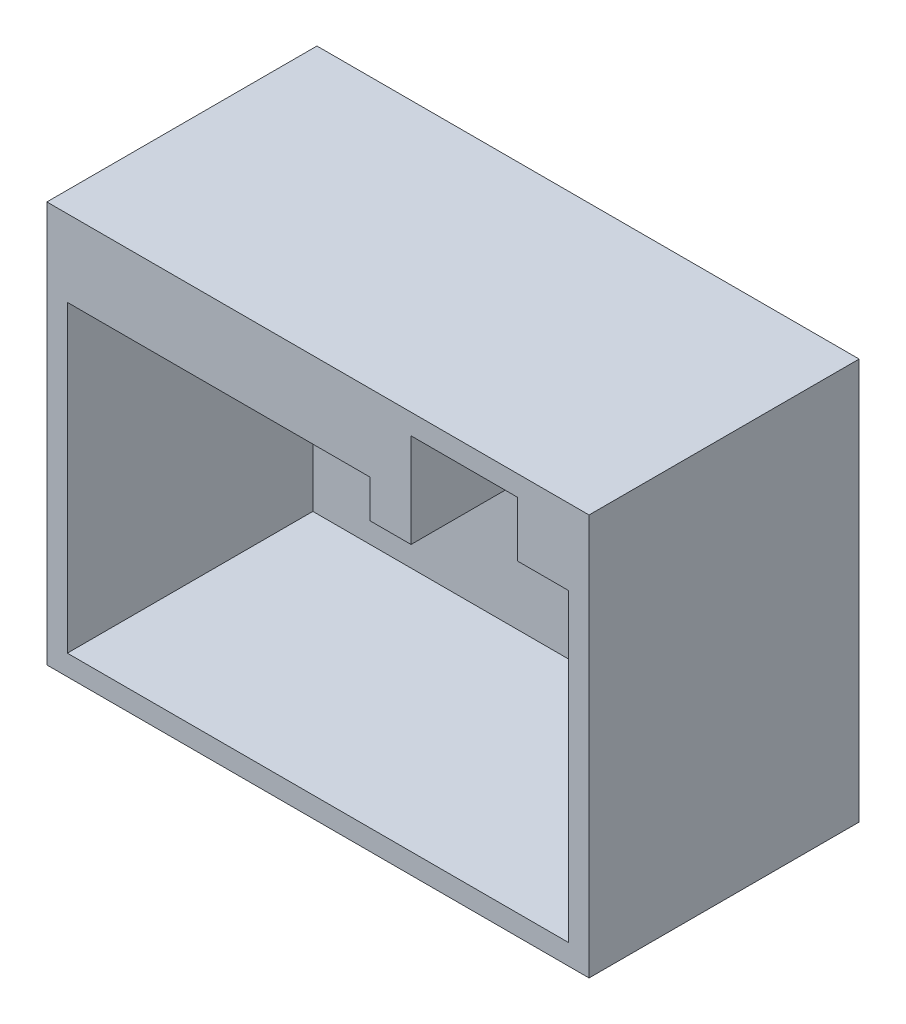
ISO-10303-21;
HEADER;
FILE_DESCRIPTION(('STEP AP214'),'2;1');
FILE_NAME('part.step','',(''),(''),'','','');
FILE_SCHEMA(('AUTOMOTIVE_DESIGN { 1 0 10303 214 1 1 1 1 }'));
ENDSEC;
DATA;
#1=APPLICATION_CONTEXT('core data for automotive mechanical design processes');
#2=APPLICATION_PROTOCOL_DEFINITION('international standard','automotive_design',2000,#1);
#3=PRODUCT_CONTEXT('',#1,'mechanical');
#4=PRODUCT('Part','Part','',(#3));
#5=PRODUCT_RELATED_PRODUCT_CATEGORY('part','',(#4));
#6=PRODUCT_DEFINITION_FORMATION('','',#4);
#7=PRODUCT_DEFINITION_CONTEXT('part definition',#1,'design');
#8=PRODUCT_DEFINITION('design','',#6,#7);
#9=PRODUCT_DEFINITION_SHAPE('','',#8);
#10=(LENGTH_UNIT() NAMED_UNIT(*) SI_UNIT(.MILLI.,.METRE.));
#11=(NAMED_UNIT(*) PLANE_ANGLE_UNIT() SI_UNIT($,.RADIAN.));
#12=(NAMED_UNIT(*) SI_UNIT($,.STERADIAN.) SOLID_ANGLE_UNIT());
#13=UNCERTAINTY_MEASURE_WITH_UNIT(LENGTH_MEASURE(1.E-05),#10,'distance_accuracy_value','');
#14=(GEOMETRIC_REPRESENTATION_CONTEXT(3) GLOBAL_UNCERTAINTY_ASSIGNED_CONTEXT((#13)) GLOBAL_UNIT_ASSIGNED_CONTEXT((#10,
#11,#12)) REPRESENTATION_CONTEXT('',''));
#15=CARTESIAN_POINT('',(0.,0.,0.));
#16=DIRECTION('',(0.,0.,1.));
#17=DIRECTION('',(1.,0.,0.));
#18=AXIS2_PLACEMENT_3D('',#15,#16,#17);
#19=CARTESIAN_POINT('',(0.,4470.4,-304.8));
#20=DIRECTION('',(0.,-1.,0.));
#21=DIRECTION('',(0.,0.,-1.));
#22=AXIS2_PLACEMENT_3D('',#19,#20,#21);
#23=PLANE('',#22);
#24=DIRECTION('',(1.,0.,0.));
#25=VECTOR('',#24,1.);
#26=CARTESIAN_POINT('',(0.,4470.4,0.));
#27=LINE('',#26,#25);
#28=CARTESIAN_POINT('',(4267.2,4470.4,0.));
#29=VERTEX_POINT('',#28);
#30=CARTESIAN_POINT('',(5588.,4470.4,0.));
#31=VERTEX_POINT('',#30);
#32=EDGE_CURVE('E218',#29,#31,#27,.T.);
#33=ORIENTED_EDGE('',*,*,#32,.T.);
#34=DIRECTION('',(0.,0.,-1.));
#35=VECTOR('',#34,1.);
#36=CARTESIAN_POINT('',(5588.,4470.4,7472.26879834397));
#37=LINE('',#36,#35);
#38=CARTESIAN_POINT('',(5588.,4470.4,3048.));
#39=VERTEX_POINT('',#38);
#40=EDGE_CURVE('E193',#39,#31,#37,.T.);
#41=ORIENTED_EDGE('',*,*,#40,.F.);
#42=DIRECTION('',(1.,0.,0.));
#43=VECTOR('',#42,1.);
#44=CARTESIAN_POINT('',(0.,4470.4,3048.));
#45=LINE('',#44,#43);
#46=CARTESIAN_POINT('',(4267.2,4470.4,3048.));
#47=VERTEX_POINT('',#46);
#48=EDGE_CURVE('E104',#47,#39,#45,.T.);
#49=ORIENTED_EDGE('',*,*,#48,.F.);
#50=DIRECTION('',(0.,0.,-1.));
#51=VECTOR('',#50,1.);
#52=CARTESIAN_POINT('',(4267.2,4470.4,7472.26879834397));
#53=LINE('',#52,#51);
#54=EDGE_CURVE('E310',#47,#29,#53,.T.);
#55=ORIENTED_EDGE('',*,*,#54,.T.);
#56=EDGE_LOOP('',(#33,#41,#49,#55));
#57=FACE_BOUND('',#56,.T.);
#58=ADVANCED_FACE('F81',(#57),#23,.T.);
#59=CARTESIAN_POINT('',(6223.,0.,-304.8));
#60=DIRECTION('',(1.,0.,0.));
#61=DIRECTION('',(0.,0.,-1.));
#62=AXIS2_PLACEMENT_3D('',#59,#60,#61);
#63=PLANE('',#62);
#64=DIRECTION('',(0.,0.,-1.));
#65=VECTOR('',#64,1.);
#66=CARTESIAN_POINT('',(6223.,3784.6,7472.26879834397));
#67=LINE('',#66,#65);
#68=CARTESIAN_POINT('',(6223.,3784.6,3048.));
#69=VERTEX_POINT('',#68);
#70=CARTESIAN_POINT('',(6223.,3784.6,0.));
#71=VERTEX_POINT('',#70);
#72=EDGE_CURVE('E188',#69,#71,#67,.T.);
#73=ORIENTED_EDGE('',*,*,#72,.T.);
#74=DIRECTION('',(0.,1.,0.));
#75=VECTOR('',#74,1.);
#76=CARTESIAN_POINT('',(6223.,0.,0.));
#77=LINE('',#76,#75);
#78=CARTESIAN_POINT('',(6223.,0.,0.));
#79=VERTEX_POINT('',#78);
#80=EDGE_CURVE('E198',#79,#71,#77,.T.);
#81=ORIENTED_EDGE('',*,*,#80,.F.);
#82=DIRECTION('',(0.,0.,1.));
#83=VECTOR('',#82,1.);
#84=CARTESIAN_POINT('',(6223.,0.,-304.8));
#85=LINE('',#84,#83);
#86=CARTESIAN_POINT('',(6223.,0.,3048.));
#87=VERTEX_POINT('',#86);
#88=EDGE_CURVE('E241',#79,#87,#85,.T.);
#89=ORIENTED_EDGE('',*,*,#88,.T.);
#90=DIRECTION('',(0.,1.,0.));
#91=VECTOR('',#90,1.);
#92=CARTESIAN_POINT('',(6223.,0.,3048.));
#93=LINE('',#92,#91);
#94=EDGE_CURVE('E201',#87,#69,#93,.T.);
#95=ORIENTED_EDGE('',*,*,#94,.T.);
#96=EDGE_LOOP('',(#73,#81,#89,#95));
#97=FACE_BOUND('',#96,.T.);
#98=ADVANCED_FACE('F197',(#97),#63,.F.);
#99=CARTESIAN_POINT('',(0.,0.,0.));
#100=DIRECTION('',(0.,0.,1.));
#101=DIRECTION('',(1.,0.,0.));
#102=AXIS2_PLACEMENT_3D('',#99,#100,#101);
#103=PLANE('',#102);
#104=DIRECTION('',(1.,0.,0.));
#105=VECTOR('',#104,1.);
#106=CARTESIAN_POINT('',(0.,3784.6,0.));
#107=LINE('',#106,#105);
#108=CARTESIAN_POINT('',(5588.,3784.6,0.));
#109=VERTEX_POINT('',#108);
#110=EDGE_CURVE('E184',#109,#71,#107,.T.);
#111=ORIENTED_EDGE('',*,*,#110,.F.);
#112=DIRECTION('',(0.,-1.,0.));
#113=VECTOR('',#112,1.);
#114=CARTESIAN_POINT('',(5588.,0.,0.));
#115=LINE('',#114,#113);
#116=EDGE_CURVE('E96',#31,#109,#115,.T.);
#117=ORIENTED_EDGE('',*,*,#116,.F.);
#118=ORIENTED_EDGE('',*,*,#32,.F.);
#119=DIRECTION('',(0.,-1.,0.));
#120=VECTOR('',#119,1.);
#121=CARTESIAN_POINT('',(4267.2,0.,0.));
#122=LINE('',#121,#120);
#123=CARTESIAN_POINT('',(4267.2,3302.,0.));
#124=VERTEX_POINT('',#123);
#125=EDGE_CURVE('E311',#29,#124,#122,.T.);
#126=ORIENTED_EDGE('',*,*,#125,.T.);
#127=DIRECTION('',(-1.,0.,0.));
#128=VECTOR('',#127,1.);
#129=CARTESIAN_POINT('',(0.,3302.,0.));
#130=LINE('',#129,#128);
#131=CARTESIAN_POINT('',(3759.2,3302.,0.));
#132=VERTEX_POINT('',#131);
#133=EDGE_CURVE('E329',#124,#132,#130,.T.);
#134=ORIENTED_EDGE('',*,*,#133,.T.);
#135=DIRECTION('',(0.,1.,0.));
#136=VECTOR('',#135,1.);
#137=CARTESIAN_POINT('',(3759.2,0.,0.));
#138=LINE('',#137,#136);
#139=CARTESIAN_POINT('',(3759.2,3771.9,0.));
#140=VERTEX_POINT('',#139);
#141=EDGE_CURVE('E326',#132,#140,#138,.T.);
#142=ORIENTED_EDGE('',*,*,#141,.T.);
#143=DIRECTION('',(-1.,0.,0.));
#144=VECTOR('',#143,1.);
#145=CARTESIAN_POINT('',(-4.45589511234691E-13,3771.9,0.));
#146=LINE('',#145,#144);
#147=CARTESIAN_POINT('',(0.,3771.9,0.));
#148=VERTEX_POINT('',#147);
#149=EDGE_CURVE('E324',#140,#148,#146,.T.);
#150=ORIENTED_EDGE('',*,*,#149,.T.);
#151=DIRECTION('',(0.,1.,0.));
#152=VECTOR('',#151,1.);
#153=CARTESIAN_POINT('',(0.,0.,0.));
#154=LINE('',#153,#152);
#155=CARTESIAN_POINT('',(0.,0.,-1.11022302462516E-13));
#156=VERTEX_POINT('',#155);
#157=EDGE_CURVE('E210',#156,#148,#154,.T.);
#158=ORIENTED_EDGE('',*,*,#157,.F.);
#159=DIRECTION('',(1.,0.,0.));
#160=VECTOR('',#159,1.);
#161=CARTESIAN_POINT('',(0.,0.,0.));
#162=LINE('',#161,#160);
#163=EDGE_CURVE('E205',#156,#79,#162,.T.);
#164=ORIENTED_EDGE('',*,*,#163,.T.);
#165=ORIENTED_EDGE('',*,*,#80,.T.);
#166=EDGE_LOOP('',(#111,#117,#118,#126,#134,#142,#150,#158,#164,#165));
#167=FACE_BOUND('',#166,.T.);
#168=ADVANCED_FACE('F203',(#167),#103,.T.);
#169=CARTESIAN_POINT('',(0.,0.,-304.8));
#170=DIRECTION('',(0.,0.,-1.));
#171=DIRECTION('',(-1.,0.,0.));
#172=AXIS2_PLACEMENT_3D('',#169,#170,#171);
#173=PLANE('',#172);
#174=DIRECTION('',(0.,1.,0.));
#175=VECTOR('',#174,1.);
#176=CARTESIAN_POINT('',(-254.,0.,-304.8));
#177=LINE('',#176,#175);
#178=CARTESIAN_POINT('',(-254.,-254.,-304.8));
#179=VERTEX_POINT('',#178);
#180=CARTESIAN_POINT('',(-254.,4724.4,-304.8));
#181=VERTEX_POINT('',#180);
#182=EDGE_CURVE('E243',#179,#181,#177,.T.);
#183=ORIENTED_EDGE('',*,*,#182,.T.);
#184=DIRECTION('',(1.,0.,0.));
#185=VECTOR('',#184,1.);
#186=CARTESIAN_POINT('',(0.,4724.4,-304.8));
#187=LINE('',#186,#185);
#188=CARTESIAN_POINT('',(6477.,4724.4,-304.8));
#189=VERTEX_POINT('',#188);
#190=EDGE_CURVE('E246',#181,#189,#187,.T.);
#191=ORIENTED_EDGE('',*,*,#190,.T.);
#192=DIRECTION('',(0.,1.,0.));
#193=VECTOR('',#192,1.);
#194=CARTESIAN_POINT('',(6477.,0.,-304.8));
#195=LINE('',#194,#193);
#196=CARTESIAN_POINT('',(6477.,-254.,-304.8));
#197=VERTEX_POINT('',#196);
#198=EDGE_CURVE('E248',#197,#189,#195,.T.);
#199=ORIENTED_EDGE('',*,*,#198,.F.);
#200=DIRECTION('',(1.,0.,0.));
#201=VECTOR('',#200,1.);
#202=CARTESIAN_POINT('',(0.,-254.,-304.8));
#203=LINE('',#202,#201);
#204=EDGE_CURVE('E251',#179,#197,#203,.T.);
#205=ORIENTED_EDGE('',*,*,#204,.F.);
#206=EDGE_LOOP('',(#183,#191,#199,#205));
#207=FACE_BOUND('',#206,.T.);
#208=ADVANCED_FACE('F276',(#207),#173,.T.);
#209=CARTESIAN_POINT('',(-254.,0.,-304.8));
#210=DIRECTION('',(1.,0.,0.));
#211=DIRECTION('',(0.,0.,-1.));
#212=AXIS2_PLACEMENT_3D('',#209,#210,#211);
#213=PLANE('',#212);
#214=DIRECTION('',(0.,0.,1.));
#215=VECTOR('',#214,1.);
#216=CARTESIAN_POINT('',(-254.,-254.,-304.8));
#217=LINE('',#216,#215);
#218=CARTESIAN_POINT('',(-254.,-254.,3048.));
#219=VERTEX_POINT('',#218);
#220=EDGE_CURVE('E254',#179,#219,#217,.T.);
#221=ORIENTED_EDGE('',*,*,#220,.T.);
#222=DIRECTION('',(0.,1.,0.));
#223=VECTOR('',#222,1.);
#224=CARTESIAN_POINT('',(-254.,0.,3048.));
#225=LINE('',#224,#223);
#226=CARTESIAN_POINT('',(-254.,4724.4,3048.));
#227=VERTEX_POINT('',#226);
#228=EDGE_CURVE('E227',#219,#227,#225,.T.);
#229=ORIENTED_EDGE('',*,*,#228,.T.);
#230=DIRECTION('',(0.,0.,1.));
#231=VECTOR('',#230,1.);
#232=CARTESIAN_POINT('',(-254.,4724.4,-304.8));
#233=LINE('',#232,#231);
#234=EDGE_CURVE('E12',#181,#227,#233,.T.);
#235=ORIENTED_EDGE('',*,*,#234,.F.);
#236=ORIENTED_EDGE('',*,*,#182,.F.);
#237=EDGE_LOOP('',(#221,#229,#235,#236));
#238=FACE_BOUND('',#237,.T.);
#239=ADVANCED_FACE('F83',(#238),#213,.F.);
#240=CARTESIAN_POINT('',(0.,4724.4,-304.8));
#241=DIRECTION('',(0.,-1.,0.));
#242=DIRECTION('',(0.,0.,-1.));
#243=AXIS2_PLACEMENT_3D('',#240,#241,#242);
#244=PLANE('',#243);
#245=ORIENTED_EDGE('',*,*,#234,.T.);
#246=DIRECTION('',(1.,0.,0.));
#247=VECTOR('',#246,1.);
#248=CARTESIAN_POINT('',(0.,4724.4,3048.));
#249=LINE('',#248,#247);
#250=CARTESIAN_POINT('',(6477.,4724.4,3048.));
#251=VERTEX_POINT('',#250);
#252=EDGE_CURVE('E230',#227,#251,#249,.T.);
#253=ORIENTED_EDGE('',*,*,#252,.T.);
#254=DIRECTION('',(0.,0.,1.));
#255=VECTOR('',#254,1.);
#256=CARTESIAN_POINT('',(6477.,4724.4,-304.8));
#257=LINE('',#256,#255);
#258=EDGE_CURVE('E89',#189,#251,#257,.T.);
#259=ORIENTED_EDGE('',*,*,#258,.F.);
#260=ORIENTED_EDGE('',*,*,#190,.F.);
#261=EDGE_LOOP('',(#245,#253,#259,#260));
#262=FACE_BOUND('',#261,.T.);
#263=ADVANCED_FACE('F268',(#262),#244,.F.);
#264=CARTESIAN_POINT('',(6477.,0.,-304.8));
#265=DIRECTION('',(1.,0.,0.));
#266=DIRECTION('',(0.,0.,-1.));
#267=AXIS2_PLACEMENT_3D('',#264,#265,#266);
#268=PLANE('',#267);
#269=ORIENTED_EDGE('',*,*,#258,.T.);
#270=DIRECTION('',(0.,1.,0.));
#271=VECTOR('',#270,1.);
#272=CARTESIAN_POINT('',(6477.,0.,3048.));
#273=LINE('',#272,#271);
#274=CARTESIAN_POINT('',(6477.,-254.,3048.));
#275=VERTEX_POINT('',#274);
#276=EDGE_CURVE('E233',#275,#251,#273,.T.);
#277=ORIENTED_EDGE('',*,*,#276,.F.);
#278=DIRECTION('',(0.,0.,1.));
#279=VECTOR('',#278,1.);
#280=CARTESIAN_POINT('',(6477.,-254.,-304.8));
#281=LINE('',#280,#279);
#282=EDGE_CURVE('E256',#197,#275,#281,.T.);
#283=ORIENTED_EDGE('',*,*,#282,.F.);
#284=ORIENTED_EDGE('',*,*,#198,.T.);
#285=EDGE_LOOP('',(#269,#277,#283,#284));
#286=FACE_BOUND('',#285,.T.);
#287=ADVANCED_FACE('F260',(#286),#268,.T.);
#288=CARTESIAN_POINT('',(0.,-254.,-304.8));
#289=DIRECTION('',(0.,-1.,0.));
#290=DIRECTION('',(0.,0.,-1.));
#291=AXIS2_PLACEMENT_3D('',#288,#289,#290);
#292=PLANE('',#291);
#293=ORIENTED_EDGE('',*,*,#282,.T.);
#294=DIRECTION('',(1.,0.,0.));
#295=VECTOR('',#294,1.);
#296=CARTESIAN_POINT('',(0.,-254.,3048.));
#297=LINE('',#296,#295);
#298=EDGE_CURVE('E236',#219,#275,#297,.T.);
#299=ORIENTED_EDGE('',*,*,#298,.F.);
#300=ORIENTED_EDGE('',*,*,#220,.F.);
#301=ORIENTED_EDGE('',*,*,#204,.T.);
#302=EDGE_LOOP('',(#293,#299,#300,#301));
#303=FACE_BOUND('',#302,.T.);
#304=ADVANCED_FACE('F274',(#303),#292,.T.);
#305=CARTESIAN_POINT('',(0.,0.,-304.8));
#306=DIRECTION('',(1.,0.,0.));
#307=DIRECTION('',(0.,0.,-1.));
#308=AXIS2_PLACEMENT_3D('',#305,#306,#307);
#309=PLANE('',#308);
#310=DIRECTION('',(0.,0.,-1.));
#311=VECTOR('',#310,1.);
#312=CARTESIAN_POINT('',(0.,3771.9,7472.26879834397));
#313=LINE('',#312,#311);
#314=CARTESIAN_POINT('',(0.,3771.9,3048.));
#315=VERTEX_POINT('',#314);
#316=EDGE_CURVE('E304',#315,#148,#313,.T.);
#317=ORIENTED_EDGE('',*,*,#316,.F.);
#318=DIRECTION('',(0.,1.,0.));
#319=VECTOR('',#318,1.);
#320=CARTESIAN_POINT('',(0.,0.,3048.));
#321=LINE('',#320,#319);
#322=CARTESIAN_POINT('',(0.,0.,3048.));
#323=VERTEX_POINT('',#322);
#324=EDGE_CURVE('E206',#323,#315,#321,.T.);
#325=ORIENTED_EDGE('',*,*,#324,.F.);
#326=DIRECTION('',(0.,0.,1.));
#327=VECTOR('',#326,1.);
#328=CARTESIAN_POINT('',(0.,0.,-304.8));
#329=LINE('',#328,#327);
#330=EDGE_CURVE('E239',#156,#323,#329,.T.);
#331=ORIENTED_EDGE('',*,*,#330,.F.);
#332=ORIENTED_EDGE('',*,*,#157,.T.);
#333=EDGE_LOOP('',(#317,#325,#331,#332));
#334=FACE_BOUND('',#333,.T.);
#335=ADVANCED_FACE('F293',(#334),#309,.T.);
#336=CARTESIAN_POINT('',(0.,0.,-304.8));
#337=DIRECTION('',(0.,-1.,0.));
#338=DIRECTION('',(0.,0.,-1.));
#339=AXIS2_PLACEMENT_3D('',#336,#337,#338);
#340=PLANE('',#339);
#341=ORIENTED_EDGE('',*,*,#88,.F.);
#342=ORIENTED_EDGE('',*,*,#163,.F.);
#343=ORIENTED_EDGE('',*,*,#330,.T.);
#344=DIRECTION('',(1.,0.,0.));
#345=VECTOR('',#344,1.);
#346=CARTESIAN_POINT('',(0.,0.,3048.));
#347=LINE('',#346,#345);
#348=EDGE_CURVE('E224',#323,#87,#347,.T.);
#349=ORIENTED_EDGE('',*,*,#348,.T.);
#350=EDGE_LOOP('',(#341,#342,#343,#349));
#351=FACE_BOUND('',#350,.T.);
#352=ADVANCED_FACE('F295',(#351),#340,.F.);
#353=CARTESIAN_POINT('',(0.,0.,3048.));
#354=DIRECTION('',(0.,0.,-1.));
#355=DIRECTION('',(-1.,0.,0.));
#356=AXIS2_PLACEMENT_3D('',#353,#354,#355);
#357=PLANE('',#356);
#358=DIRECTION('',(-1.,0.,0.));
#359=VECTOR('',#358,1.);
#360=CARTESIAN_POINT('',(0.,3784.6,3048.));
#361=LINE('',#360,#359);
#362=CARTESIAN_POINT('',(5588.,3784.6,3048.));
#363=VERTEX_POINT('',#362);
#364=EDGE_CURVE('E348',#69,#363,#361,.T.);
#365=ORIENTED_EDGE('',*,*,#364,.F.);
#366=ORIENTED_EDGE('',*,*,#94,.F.);
#367=ORIENTED_EDGE('',*,*,#348,.F.);
#368=ORIENTED_EDGE('',*,*,#324,.T.);
#369=DIRECTION('',(1.,0.,0.));
#370=VECTOR('',#369,1.);
#371=CARTESIAN_POINT('',(-4.45589511234691E-13,3771.9,3048.));
#372=LINE('',#371,#370);
#373=CARTESIAN_POINT('',(3759.2,3771.9,3048.));
#374=VERTEX_POINT('',#373);
#375=EDGE_CURVE('E220',#315,#374,#372,.T.);
#376=ORIENTED_EDGE('',*,*,#375,.T.);
#377=DIRECTION('',(0.,-1.,0.));
#378=VECTOR('',#377,1.);
#379=CARTESIAN_POINT('',(3759.2,0.,3048.));
#380=LINE('',#379,#378);
#381=CARTESIAN_POINT('',(3759.2,3302.,3048.));
#382=VERTEX_POINT('',#381);
#383=EDGE_CURVE('E318',#374,#382,#380,.T.);
#384=ORIENTED_EDGE('',*,*,#383,.T.);
#385=DIRECTION('',(1.,0.,0.));
#386=VECTOR('',#385,1.);
#387=CARTESIAN_POINT('',(0.,3302.,3048.));
#388=LINE('',#387,#386);
#389=CARTESIAN_POINT('',(4267.2,3302.,3048.));
#390=VERTEX_POINT('',#389);
#391=EDGE_CURVE('E320',#382,#390,#388,.T.);
#392=ORIENTED_EDGE('',*,*,#391,.T.);
#393=DIRECTION('',(0.,1.,0.));
#394=VECTOR('',#393,1.);
#395=CARTESIAN_POINT('',(4267.2,0.,3048.));
#396=LINE('',#395,#394);
#397=EDGE_CURVE('E342',#390,#47,#396,.T.);
#398=ORIENTED_EDGE('',*,*,#397,.T.);
#399=ORIENTED_EDGE('',*,*,#48,.T.);
#400=DIRECTION('',(0.,1.,0.));
#401=VECTOR('',#400,1.);
#402=CARTESIAN_POINT('',(5588.,0.,3048.));
#403=LINE('',#402,#401);
#404=EDGE_CURVE('E327',#363,#39,#403,.T.);
#405=ORIENTED_EDGE('',*,*,#404,.F.);
#406=EDGE_LOOP('',(#365,#366,#367,#368,#376,#384,#392,#398,#399,#405));
#407=FACE_BOUND('',#406,.T.);
#408=ORIENTED_EDGE('',*,*,#228,.F.);
#409=ORIENTED_EDGE('',*,*,#298,.T.);
#410=ORIENTED_EDGE('',*,*,#276,.T.);
#411=ORIENTED_EDGE('',*,*,#252,.F.);
#412=EDGE_LOOP('',(#408,#409,#410,#411));
#413=FACE_BOUND('',#412,.T.);
#414=ADVANCED_FACE('F266',(#407,#413),#357,.F.);
#415=CARTESIAN_POINT('',(-4.45589511234691E-13,3771.9,7472.26879834397));
#416=DIRECTION('',(0.,-1.,0.));
#417=DIRECTION('',(1.,0.,0.));
#418=AXIS2_PLACEMENT_3D('',#415,#416,#417);
#419=PLANE('',#418);
#420=ORIENTED_EDGE('',*,*,#375,.F.);
#421=ORIENTED_EDGE('',*,*,#316,.T.);
#422=ORIENTED_EDGE('',*,*,#149,.F.);
#423=DIRECTION('',(0.,0.,-1.));
#424=VECTOR('',#423,1.);
#425=CARTESIAN_POINT('',(3759.2,3771.9,7472.26879834397));
#426=LINE('',#425,#424);
#427=EDGE_CURVE('E213',#374,#140,#426,.T.);
#428=ORIENTED_EDGE('',*,*,#427,.F.);
#429=EDGE_LOOP('',(#420,#421,#422,#428));
#430=FACE_BOUND('',#429,.T.);
#431=ADVANCED_FACE('F316',(#430),#419,.T.);
#432=CARTESIAN_POINT('',(3759.2,0.,7472.26879834397));
#433=DIRECTION('',(-1.,0.,0.));
#434=DIRECTION('',(0.,0.,1.));
#435=AXIS2_PLACEMENT_3D('',#432,#433,#434);
#436=PLANE('',#435);
#437=ORIENTED_EDGE('',*,*,#383,.F.);
#438=ORIENTED_EDGE('',*,*,#427,.T.);
#439=ORIENTED_EDGE('',*,*,#141,.F.);
#440=DIRECTION('',(0.,0.,-1.));
#441=VECTOR('',#440,1.);
#442=CARTESIAN_POINT('',(3759.2,3302.,7472.26879834397));
#443=LINE('',#442,#441);
#444=EDGE_CURVE('E335',#382,#132,#443,.T.);
#445=ORIENTED_EDGE('',*,*,#444,.F.);
#446=EDGE_LOOP('',(#437,#438,#439,#445));
#447=FACE_BOUND('',#446,.T.);
#448=ADVANCED_FACE('F360',(#447),#436,.T.);
#449=CARTESIAN_POINT('',(0.,3302.,7472.26879834397));
#450=DIRECTION('',(0.,-1.,0.));
#451=DIRECTION('',(0.,0.,-1.));
#452=AXIS2_PLACEMENT_3D('',#449,#450,#451);
#453=PLANE('',#452);
#454=ORIENTED_EDGE('',*,*,#391,.F.);
#455=ORIENTED_EDGE('',*,*,#444,.T.);
#456=ORIENTED_EDGE('',*,*,#133,.F.);
#457=DIRECTION('',(0.,0.,-1.));
#458=VECTOR('',#457,1.);
#459=CARTESIAN_POINT('',(4267.2,3302.,7472.26879834397));
#460=LINE('',#459,#458);
#461=EDGE_CURVE('E333',#390,#124,#460,.T.);
#462=ORIENTED_EDGE('',*,*,#461,.F.);
#463=EDGE_LOOP('',(#454,#455,#456,#462));
#464=FACE_BOUND('',#463,.T.);
#465=ADVANCED_FACE('F358',(#464),#453,.T.);
#466=CARTESIAN_POINT('',(4267.2,0.,7472.26879834397));
#467=DIRECTION('',(1.,0.,0.));
#468=DIRECTION('',(0.,0.,-1.));
#469=AXIS2_PLACEMENT_3D('',#466,#467,#468);
#470=PLANE('',#469);
#471=ORIENTED_EDGE('',*,*,#397,.F.);
#472=ORIENTED_EDGE('',*,*,#461,.T.);
#473=ORIENTED_EDGE('',*,*,#125,.F.);
#474=ORIENTED_EDGE('',*,*,#54,.F.);
#475=EDGE_LOOP('',(#471,#472,#473,#474));
#476=FACE_BOUND('',#475,.T.);
#477=ADVANCED_FACE('F357',(#476),#470,.T.);
#478=CARTESIAN_POINT('',(5588.,0.,7472.26879834397));
#479=DIRECTION('',(1.,0.,0.));
#480=DIRECTION('',(0.,0.,-1.));
#481=AXIS2_PLACEMENT_3D('',#478,#479,#480);
#482=PLANE('',#481);
#483=DIRECTION('',(0.,0.,-1.));
#484=VECTOR('',#483,1.);
#485=CARTESIAN_POINT('',(5588.,3784.6,7472.26879834397));
#486=LINE('',#485,#484);
#487=EDGE_CURVE('E190',#363,#109,#486,.T.);
#488=ORIENTED_EDGE('',*,*,#487,.F.);
#489=ORIENTED_EDGE('',*,*,#404,.T.);
#490=ORIENTED_EDGE('',*,*,#40,.T.);
#491=ORIENTED_EDGE('',*,*,#116,.T.);
#492=EDGE_LOOP('',(#488,#489,#490,#491));
#493=FACE_BOUND('',#492,.T.);
#494=ADVANCED_FACE('F353',(#493),#482,.F.);
#495=CARTESIAN_POINT('',(0.,3784.6,7472.26879834397));
#496=DIRECTION('',(0.,1.,0.));
#497=DIRECTION('',(0.,0.,1.));
#498=AXIS2_PLACEMENT_3D('',#495,#496,#497);
#499=PLANE('',#498);
#500=ORIENTED_EDGE('',*,*,#72,.F.);
#501=ORIENTED_EDGE('',*,*,#364,.T.);
#502=ORIENTED_EDGE('',*,*,#487,.T.);
#503=ORIENTED_EDGE('',*,*,#110,.T.);
#504=EDGE_LOOP('',(#500,#501,#502,#503));
#505=FACE_BOUND('',#504,.T.);
#506=ADVANCED_FACE('F186',(#505),#499,.F.);
#507=CLOSED_SHELL('',(#58,#98,#168,#208,#239,#263,#287,#304,#335,#352,#414,#431,#448,#465,#477,
#494,#506));
#508=MANIFOLD_SOLID_BREP('B2',#507);
#509=ADVANCED_BREP_SHAPE_REPRESENTATION('',(#18,#508),#14);
#510=SHAPE_DEFINITION_REPRESENTATION(#9,#509);
ENDSEC;
END-ISO-10303-21;
